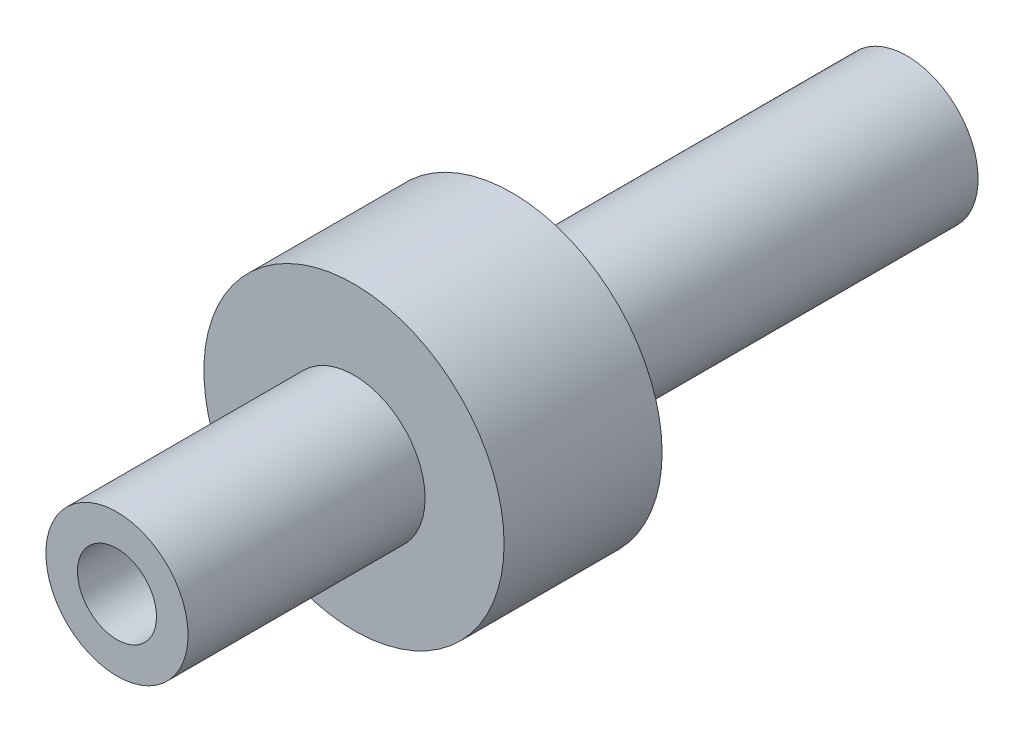
ISO-10303-21;
HEADER;
FILE_DESCRIPTION(('STEP AP214'),'2;1');
FILE_NAME('part.step','',(''),(''),'','','');
FILE_SCHEMA(('AUTOMOTIVE_DESIGN { 1 0 10303 214 1 1 1 1 }'));
ENDSEC;
DATA;
#1=APPLICATION_CONTEXT('core data for automotive mechanical design processes');
#2=APPLICATION_PROTOCOL_DEFINITION('international standard','automotive_design',2000,#1);
#3=PRODUCT_CONTEXT('',#1,'mechanical');
#4=PRODUCT('Part','Part','',(#3));
#5=PRODUCT_RELATED_PRODUCT_CATEGORY('part','',(#4));
#6=PRODUCT_DEFINITION_FORMATION('','',#4);
#7=PRODUCT_DEFINITION_CONTEXT('part definition',#1,'design');
#8=PRODUCT_DEFINITION('design','',#6,#7);
#9=PRODUCT_DEFINITION_SHAPE('','',#8);
#10=(LENGTH_UNIT() NAMED_UNIT(*) SI_UNIT(.MILLI.,.METRE.));
#11=(NAMED_UNIT(*) PLANE_ANGLE_UNIT() SI_UNIT($,.RADIAN.));
#12=(NAMED_UNIT(*) SI_UNIT($,.STERADIAN.) SOLID_ANGLE_UNIT());
#13=UNCERTAINTY_MEASURE_WITH_UNIT(LENGTH_MEASURE(1.E-05),#10,'distance_accuracy_value','');
#14=(GEOMETRIC_REPRESENTATION_CONTEXT(3) GLOBAL_UNCERTAINTY_ASSIGNED_CONTEXT((#13)) GLOBAL_UNIT_ASSIGNED_CONTEXT((#10,
#11,#12)) REPRESENTATION_CONTEXT('',''));
#15=CARTESIAN_POINT('',(0.,0.,0.));
#16=DIRECTION('',(0.,0.,1.));
#17=DIRECTION('',(1.,0.,0.));
#18=AXIS2_PLACEMENT_3D('',#15,#16,#17);
#19=CARTESIAN_POINT('',(0.,0.,5.));
#20=DIRECTION('',(0.,0.,-1.));
#21=DIRECTION('',(-1.,0.,0.));
#22=AXIS2_PLACEMENT_3D('',#19,#20,#21);
#23=CYLINDRICAL_SURFACE('',#22,4.75);
#24=CARTESIAN_POINT('',(0.,0.,5.));
#25=DIRECTION('',(0.,0.,1.));
#26=DIRECTION('',(1.,0.,0.));
#27=AXIS2_PLACEMENT_3D('',#24,#25,#26);
#28=CIRCLE('',#27,4.75);
#29=CARTESIAN_POINT('',(4.75,0.,5.));
#30=VERTEX_POINT('',#29);
#31=EDGE_CURVE('E45',#30,#30,#28,.T.);
#32=ORIENTED_EDGE('',*,*,#31,.F.);
#33=EDGE_LOOP('',(#32));
#34=FACE_BOUND('',#33,.T.);
#35=CARTESIAN_POINT('',(0.,0.,0.));
#36=DIRECTION('',(0.,0.,1.));
#37=DIRECTION('',(1.,0.,0.));
#38=AXIS2_PLACEMENT_3D('',#35,#36,#37);
#39=CIRCLE('',#38,4.75);
#40=CARTESIAN_POINT('',(4.75,0.,0.));
#41=VERTEX_POINT('',#40);
#42=EDGE_CURVE('E36',#41,#41,#39,.T.);
#43=ORIENTED_EDGE('',*,*,#42,.T.);
#44=EDGE_LOOP('',(#43));
#45=FACE_BOUND('',#44,.T.);
#46=ADVANCED_FACE('F33',(#34,#45),#23,.T.);
#47=CARTESIAN_POINT('',(0.,0.,5.));
#48=DIRECTION('',(0.,0.,1.));
#49=DIRECTION('',(1.,0.,0.));
#50=AXIS2_PLACEMENT_3D('',#47,#48,#49);
#51=PLANE('',#50);
#52=CARTESIAN_POINT('',(0.,0.,5.));
#53=DIRECTION('',(0.,0.,1.));
#54=DIRECTION('',(1.,0.,0.));
#55=AXIS2_PLACEMENT_3D('',#52,#53,#54);
#56=CIRCLE('',#55,2.25);
#57=CARTESIAN_POINT('',(2.25,0.,5.));
#58=VERTEX_POINT('',#57);
#59=EDGE_CURVE('E40',#58,#58,#56,.T.);
#60=ORIENTED_EDGE('',*,*,#59,.F.);
#61=EDGE_LOOP('',(#60));
#62=FACE_BOUND('',#61,.T.);
#63=ORIENTED_EDGE('',*,*,#31,.T.);
#64=EDGE_LOOP('',(#63));
#65=FACE_BOUND('',#64,.T.);
#66=ADVANCED_FACE('F63',(#62,#65),#51,.T.);
#67=CARTESIAN_POINT('',(0.,0.,0.));
#68=DIRECTION('',(0.,0.,1.));
#69=DIRECTION('',(1.,0.,0.));
#70=AXIS2_PLACEMENT_3D('',#67,#68,#69);
#71=PLANE('',#70);
#72=CARTESIAN_POINT('',(0.,0.,0.));
#73=DIRECTION('',(0.,0.,-1.));
#74=DIRECTION('',(-1.,0.,0.));
#75=AXIS2_PLACEMENT_3D('',#72,#73,#74);
#76=CIRCLE('',#75,2.25);
#77=CARTESIAN_POINT('',(-2.25,0.,0.));
#78=VERTEX_POINT('',#77);
#79=EDGE_CURVE('E10',#78,#78,#76,.T.);
#80=ORIENTED_EDGE('',*,*,#79,.F.);
#81=EDGE_LOOP('',(#80));
#82=FACE_BOUND('',#81,.T.);
#83=ORIENTED_EDGE('',*,*,#42,.F.);
#84=EDGE_LOOP('',(#83));
#85=FACE_BOUND('',#84,.T.);
#86=ADVANCED_FACE('F60',(#82,#85),#71,.F.);
#87=CARTESIAN_POINT('',(0.,0.,12.5));
#88=DIRECTION('',(0.,0.,-1.));
#89=DIRECTION('',(-1.,0.,0.));
#90=AXIS2_PLACEMENT_3D('',#87,#88,#89);
#91=CYLINDRICAL_SURFACE('',#90,2.25);
#92=CARTESIAN_POINT('',(0.,0.,12.5));
#93=DIRECTION('',(0.,0.,1.));
#94=DIRECTION('',(1.,0.,0.));
#95=AXIS2_PLACEMENT_3D('',#92,#93,#94);
#96=CIRCLE('',#95,2.25);
#97=CARTESIAN_POINT('',(2.25,0.,12.5));
#98=VERTEX_POINT('',#97);
#99=EDGE_CURVE('E51',#98,#98,#96,.T.);
#100=ORIENTED_EDGE('',*,*,#99,.F.);
#101=EDGE_LOOP('',(#100));
#102=FACE_BOUND('',#101,.T.);
#103=ORIENTED_EDGE('',*,*,#59,.T.);
#104=EDGE_LOOP('',(#103));
#105=FACE_BOUND('',#104,.T.);
#106=ADVANCED_FACE('F62',(#102,#105),#91,.T.);
#107=CARTESIAN_POINT('',(0.,0.,12.5));
#108=DIRECTION('',(0.,0.,1.));
#109=DIRECTION('',(1.,0.,0.));
#110=AXIS2_PLACEMENT_3D('',#107,#108,#109);
#111=PLANE('',#110);
#112=CARTESIAN_POINT('',(0.,0.,12.5));
#113=DIRECTION('',(0.,0.,1.));
#114=DIRECTION('',(1.,0.,0.));
#115=AXIS2_PLACEMENT_3D('',#112,#113,#114);
#116=CIRCLE('',#115,1.25);
#117=CARTESIAN_POINT('',(1.25,0.,12.5));
#118=VERTEX_POINT('',#117);
#119=EDGE_CURVE('E168',#118,#118,#116,.T.);
#120=ORIENTED_EDGE('',*,*,#119,.F.);
#121=EDGE_LOOP('',(#120));
#122=FACE_BOUND('',#121,.T.);
#123=ORIENTED_EDGE('',*,*,#99,.T.);
#124=EDGE_LOOP('',(#123));
#125=FACE_BOUND('',#124,.T.);
#126=ADVANCED_FACE('F69',(#122,#125),#111,.T.);
#127=CARTESIAN_POINT('',(0.,0.,-12.5));
#128=DIRECTION('',(0.,0.,1.));
#129=DIRECTION('',(1.,0.,0.));
#130=AXIS2_PLACEMENT_3D('',#127,#128,#129);
#131=CYLINDRICAL_SURFACE('',#130,2.25);
#132=CARTESIAN_POINT('',(0.,0.,-12.5));
#133=DIRECTION('',(0.,0.,-1.));
#134=DIRECTION('',(-1.,0.,0.));
#135=AXIS2_PLACEMENT_3D('',#132,#133,#134);
#136=CIRCLE('',#135,2.25);
#137=CARTESIAN_POINT('',(-2.25,0.,-12.5));
#138=VERTEX_POINT('',#137);
#139=EDGE_CURVE('E49',#138,#138,#136,.T.);
#140=ORIENTED_EDGE('',*,*,#139,.F.);
#141=EDGE_LOOP('',(#140));
#142=FACE_BOUND('',#141,.T.);
#143=ORIENTED_EDGE('',*,*,#79,.T.);
#144=EDGE_LOOP('',(#143));
#145=FACE_BOUND('',#144,.T.);
#146=ADVANCED_FACE('F99',(#142,#145),#131,.T.);
#147=CARTESIAN_POINT('',(0.,0.,-12.5));
#148=DIRECTION('',(0.,0.,-1.));
#149=DIRECTION('',(-1.,0.,0.));
#150=AXIS2_PLACEMENT_3D('',#147,#148,#149);
#151=PLANE('',#150);
#152=CARTESIAN_POINT('',(0.,0.,-12.5));
#153=DIRECTION('',(0.,0.,-1.));
#154=DIRECTION('',(-1.,0.,0.));
#155=AXIS2_PLACEMENT_3D('',#152,#153,#154);
#156=CIRCLE('',#155,1.25);
#157=CARTESIAN_POINT('',(-1.25,0.,-12.5));
#158=VERTEX_POINT('',#157);
#159=EDGE_CURVE('E169',#158,#158,#156,.T.);
#160=ORIENTED_EDGE('',*,*,#159,.F.);
#161=EDGE_LOOP('',(#160));
#162=FACE_BOUND('',#161,.T.);
#163=ORIENTED_EDGE('',*,*,#139,.T.);
#164=EDGE_LOOP('',(#163));
#165=FACE_BOUND('',#164,.T.);
#166=ADVANCED_FACE('F104',(#162,#165),#151,.T.);
#167=CARTESIAN_POINT('',(0.,0.,7.5));
#168=DIRECTION('',(0.,0.,1.));
#169=DIRECTION('',(1.,0.,0.));
#170=AXIS2_PLACEMENT_3D('',#167,#168,#169);
#171=CYLINDRICAL_SURFACE('',#170,1.25);
#172=CARTESIAN_POINT('',(0.,0.,7.5));
#173=DIRECTION('',(0.,0.,1.));
#174=DIRECTION('',(1.,0.,0.));
#175=AXIS2_PLACEMENT_3D('',#172,#173,#174);
#176=CIRCLE('',#175,1.25);
#177=CARTESIAN_POINT('',(1.25,0.,7.5));
#178=VERTEX_POINT('',#177);
#179=EDGE_CURVE('E172',#178,#178,#176,.T.);
#180=ORIENTED_EDGE('',*,*,#179,.F.);
#181=EDGE_LOOP('',(#180));
#182=FACE_BOUND('',#181,.T.);
#183=ORIENTED_EDGE('',*,*,#119,.T.);
#184=EDGE_LOOP('',(#183));
#185=FACE_BOUND('',#184,.T.);
#186=ADVANCED_FACE('F119',(#182,#185),#171,.F.);
#187=CARTESIAN_POINT('',(0.,0.,7.5));
#188=DIRECTION('',(0.,0.,1.));
#189=DIRECTION('',(1.,0.,0.));
#190=AXIS2_PLACEMENT_3D('',#187,#188,#189);
#191=PLANE('',#190);
#192=ORIENTED_EDGE('',*,*,#179,.T.);
#193=EDGE_LOOP('',(#192));
#194=FACE_BOUND('',#193,.T.);
#195=ADVANCED_FACE('F124',(#194),#191,.T.);
#196=CARTESIAN_POINT('',(0.,0.,-7.5));
#197=DIRECTION('',(0.,0.,-1.));
#198=DIRECTION('',(-1.,0.,0.));
#199=AXIS2_PLACEMENT_3D('',#196,#197,#198);
#200=CYLINDRICAL_SURFACE('',#199,1.25);
#201=CARTESIAN_POINT('',(0.,0.,-7.5));
#202=DIRECTION('',(0.,0.,-1.));
#203=DIRECTION('',(-1.,0.,0.));
#204=AXIS2_PLACEMENT_3D('',#201,#202,#203);
#205=CIRCLE('',#204,1.25);
#206=CARTESIAN_POINT('',(-1.25,0.,-7.5));
#207=VERTEX_POINT('',#206);
#208=EDGE_CURVE('E167',#207,#207,#205,.T.);
#209=ORIENTED_EDGE('',*,*,#208,.F.);
#210=EDGE_LOOP('',(#209));
#211=FACE_BOUND('',#210,.T.);
#212=ORIENTED_EDGE('',*,*,#159,.T.);
#213=EDGE_LOOP('',(#212));
#214=FACE_BOUND('',#213,.T.);
#215=ADVANCED_FACE('F134',(#211,#214),#200,.F.);
#216=CARTESIAN_POINT('',(0.,0.,-7.5));
#217=DIRECTION('',(0.,0.,-1.));
#218=DIRECTION('',(-1.,0.,0.));
#219=AXIS2_PLACEMENT_3D('',#216,#217,#218);
#220=PLANE('',#219);
#221=ORIENTED_EDGE('',*,*,#208,.T.);
#222=EDGE_LOOP('',(#221));
#223=FACE_BOUND('',#222,.T.);
#224=ADVANCED_FACE('F151',(#223),#220,.T.);
#225=CLOSED_SHELL('',(#46,#66,#86,#106,#126,#146,#166,#186,#195,#215,#224));
#226=MANIFOLD_SOLID_BREP('B2',#225);
#227=ADVANCED_BREP_SHAPE_REPRESENTATION('',(#18,#226),#14);
#228=SHAPE_DEFINITION_REPRESENTATION(#9,#227);
ENDSEC;
END-ISO-10303-21;
